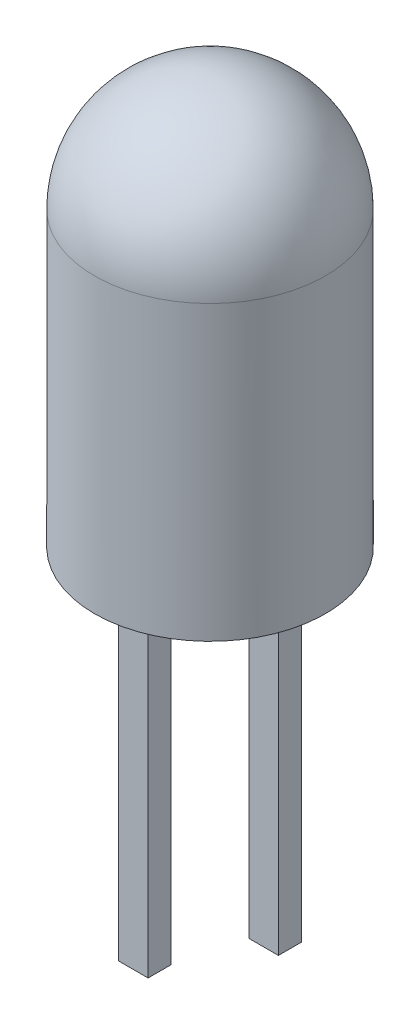
ISO-10303-21;
HEADER;
FILE_DESCRIPTION(('STEP AP214'),'2;1');
FILE_NAME('part.step','',(''),(''),'','','');
FILE_SCHEMA(('AUTOMOTIVE_DESIGN { 1 0 10303 214 1 1 1 1 }'));
ENDSEC;
DATA;
#1=APPLICATION_CONTEXT('core data for automotive mechanical design processes');
#2=APPLICATION_PROTOCOL_DEFINITION('international standard','automotive_design',2000,#1);
#3=PRODUCT_CONTEXT('',#1,'mechanical');
#4=PRODUCT('Part','Part','',(#3));
#5=PRODUCT_RELATED_PRODUCT_CATEGORY('part','',(#4));
#6=PRODUCT_DEFINITION_FORMATION('','',#4);
#7=PRODUCT_DEFINITION_CONTEXT('part definition',#1,'design');
#8=PRODUCT_DEFINITION('design','',#6,#7);
#9=PRODUCT_DEFINITION_SHAPE('','',#8);
#10=(LENGTH_UNIT() NAMED_UNIT(*) SI_UNIT(.MILLI.,.METRE.));
#11=(NAMED_UNIT(*) PLANE_ANGLE_UNIT() SI_UNIT($,.RADIAN.));
#12=(NAMED_UNIT(*) SI_UNIT($,.STERADIAN.) SOLID_ANGLE_UNIT());
#13=UNCERTAINTY_MEASURE_WITH_UNIT(LENGTH_MEASURE(1.E-05),#10,'distance_accuracy_value','');
#14=(GEOMETRIC_REPRESENTATION_CONTEXT(3) GLOBAL_UNCERTAINTY_ASSIGNED_CONTEXT((#13)) GLOBAL_UNIT_ASSIGNED_CONTEXT((#10,
#11,#12)) REPRESENTATION_CONTEXT('',''));
#15=CARTESIAN_POINT('',(0.,0.,0.));
#16=DIRECTION('',(0.,0.,1.));
#17=DIRECTION('',(1.,0.,0.));
#18=AXIS2_PLACEMENT_3D('',#15,#16,#17);
#19=CARTESIAN_POINT('',(-0.0605595659989582,2.80694027615572,0.));
#20=DIRECTION('',(0.,-1.,0.));
#21=DIRECTION('',(1.,0.,0.));
#22=AXIS2_PLACEMENT_3D('',#19,#20,#21);
#23=CYLINDRICAL_SURFACE('',#22,0.189425793844278);
#24=CARTESIAN_POINT('',(-0.0605595659989582,2.80694027615572,0.));
#25=DIRECTION('',(0.,1.,0.));
#26=DIRECTION('',(-1.,0.,0.));
#27=AXIS2_PLACEMENT_3D('',#24,#25,#26);
#28=CIRCLE('',#27,0.189425793844278);
#29=CARTESIAN_POINT('',(-0.249985359843236,2.80694027615572,0.));
#30=VERTEX_POINT('',#29);
#31=EDGE_CURVE('E11',#30,#30,#28,.T.);
#32=ORIENTED_EDGE('',*,*,#31,.F.);
#33=EDGE_LOOP('',(#32));
#34=FACE_BOUND('',#33,.T.);
#35=CARTESIAN_POINT('',(-0.0605595659989582,2.70694027615572,0.));
#36=DIRECTION('',(0.,1.,0.));
#37=DIRECTION('',(-1.,0.,0.));
#38=AXIS2_PLACEMENT_3D('',#35,#36,#37);
#39=CIRCLE('',#38,0.189425793844278);
#40=CARTESIAN_POINT('',(-0.249985359843236,2.70694027615572,0.));
#41=VERTEX_POINT('',#40);
#42=EDGE_CURVE('E51',#41,#41,#39,.T.);
#43=ORIENTED_EDGE('',*,*,#42,.T.);
#44=EDGE_LOOP('',(#43));
#45=FACE_BOUND('',#44,.T.);
#46=ADVANCED_FACE('F48',(#34,#45),#23,.T.);
#47=CARTESIAN_POINT('',(-0.0605595659989582,2.80694027615572,0.));
#48=DIRECTION('',(0.,1.,0.));
#49=DIRECTION('',(-1.,0.,0.));
#50=AXIS2_PLACEMENT_3D('',#47,#48,#49);
#51=PLANE('',#50);
#52=ORIENTED_EDGE('',*,*,#31,.T.);
#53=EDGE_LOOP('',(#52));
#54=FACE_BOUND('',#53,.T.);
#55=ADVANCED_FACE('F63',(#54),#51,.T.);
#56=CARTESIAN_POINT('',(-0.0605595659989582,2.70694027615572,0.));
#57=DIRECTION('',(0.,1.,0.));
#58=DIRECTION('',(-1.,0.,0.));
#59=AXIS2_PLACEMENT_3D('',#56,#57,#58);
#60=PLANE('',#59);
#61=ORIENTED_EDGE('',*,*,#42,.F.);
#62=EDGE_LOOP('',(#61));
#63=FACE_BOUND('',#62,.T.);
#64=ADVANCED_FACE('F61',(#63),#60,.F.);
#65=CLOSED_SHELL('',(#46,#55,#64));
#66=MANIFOLD_SOLID_BREP('B2',#65);
#67=CARTESIAN_POINT('',(0.654816514950922,-4.,0.149242281114547));
#68=DIRECTION('',(1.,0.,0.));
#69=DIRECTION('',(0.,0.,-1.));
#70=AXIS2_PLACEMENT_3D('',#67,#68,#69);
#71=PLANE('',#70);
#72=DIRECTION('',(0.,1.,0.));
#73=VECTOR('',#72,1.);
#74=CARTESIAN_POINT('',(0.654816514950922,-4.,0.149242281114547));
#75=LINE('',#74,#73);
#76=CARTESIAN_POINT('',(0.654816514950922,-4.,0.149242281114547));
#77=VERTEX_POINT('',#76);
#78=CARTESIAN_POINT('',(0.654816514950922,0.,0.149242281114547));
#79=VERTEX_POINT('',#78);
#80=EDGE_CURVE('E495',#77,#79,#75,.T.);
#81=ORIENTED_EDGE('',*,*,#80,.T.);
#82=DIRECTION('',(0.,0.,-1.));
#83=VECTOR('',#82,1.);
#84=CARTESIAN_POINT('',(0.654816514950922,0.,0.15));
#85=LINE('',#84,#83);
#86=CARTESIAN_POINT('',(0.654816514950922,0.,0.15));
#87=VERTEX_POINT('',#86);
#88=EDGE_CURVE('E251',#87,#79,#85,.T.);
#89=ORIENTED_EDGE('',*,*,#88,.F.);
#90=DIRECTION('',(0.,-1.,0.));
#91=VECTOR('',#90,1.);
#92=CARTESIAN_POINT('',(0.654816514950922,1.55125542870119,0.15));
#93=LINE('',#92,#91);
#94=CARTESIAN_POINT('',(0.654816514950922,1.55125542870119,0.15));
#95=VERTEX_POINT('',#94);
#96=EDGE_CURVE('E325',#95,#87,#93,.T.);
#97=ORIENTED_EDGE('',*,*,#96,.F.);
#98=DIRECTION('',(0.,0.,-1.));
#99=VECTOR('',#98,1.);
#100=CARTESIAN_POINT('',(0.654816514950922,1.55125542870119,0.15));
#101=LINE('',#100,#99);
#102=CARTESIAN_POINT('',(0.654816514950922,1.55125542870119,-0.15));
#103=VERTEX_POINT('',#102);
#104=EDGE_CURVE('E246',#95,#103,#101,.T.);
#105=ORIENTED_EDGE('',*,*,#104,.T.);
#106=DIRECTION('',(0.,-1.,0.));
#107=VECTOR('',#106,1.);
#108=CARTESIAN_POINT('',(0.654816514950922,1.55125542870119,-0.15));
#109=LINE('',#108,#107);
#110=CARTESIAN_POINT('',(0.654816514950922,0.,-0.15));
#111=VERTEX_POINT('',#110);
#112=EDGE_CURVE('E269',#103,#111,#109,.T.);
#113=ORIENTED_EDGE('',*,*,#112,.T.);
#114=CARTESIAN_POINT('',(0.654816514950922,0.,-0.149242281114547));
#115=VERTEX_POINT('',#114);
#116=EDGE_CURVE('E235',#115,#111,#85,.T.);
#117=ORIENTED_EDGE('',*,*,#116,.F.);
#118=DIRECTION('',(0.,1.,0.));
#119=VECTOR('',#118,1.);
#120=CARTESIAN_POINT('',(0.654816514950922,-4.,-0.149242281114547));
#121=LINE('',#120,#119);
#122=CARTESIAN_POINT('',(0.654816514950922,-4.,-0.149242281114547));
#123=VERTEX_POINT('',#122);
#124=EDGE_CURVE('E46',#123,#115,#121,.T.);
#125=ORIENTED_EDGE('',*,*,#124,.F.);
#126=DIRECTION('',(0.,0.,-1.));
#127=VECTOR('',#126,1.);
#128=CARTESIAN_POINT('',(0.654816514950922,-4.,0.149242281114547));
#129=LINE('',#128,#127);
#130=EDGE_CURVE('E486',#77,#123,#129,.T.);
#131=ORIENTED_EDGE('',*,*,#130,.F.);
#132=EDGE_LOOP('',(#81,#89,#97,#105,#113,#117,#125,#131));
#133=FACE_BOUND('',#132,.T.);
#134=ADVANCED_FACE('F99',(#133),#71,.F.);
#135=CARTESIAN_POINT('',(1.03787854119038,-4.,-0.149242281114547));
#136=DIRECTION('',(0.,0.,1.));
#137=DIRECTION('',(1.,0.,0.));
#138=AXIS2_PLACEMENT_3D('',#135,#136,#137);
#139=PLANE('',#138);
#140=DIRECTION('',(1.,0.,0.));
#141=VECTOR('',#140,1.);
#142=CARTESIAN_POINT('',(1.03787854119038,0.,-0.149242281114547));
#143=LINE('',#142,#141);
#144=CARTESIAN_POINT('',(1.03787854119038,0.,-0.149242281114547));
#145=VERTEX_POINT('',#144);
#146=EDGE_CURVE('E222',#115,#145,#143,.T.);
#147=ORIENTED_EDGE('',*,*,#146,.T.);
#148=DIRECTION('',(0.,1.,0.));
#149=VECTOR('',#148,1.);
#150=CARTESIAN_POINT('',(1.03787854119038,-4.,-0.149242281114547));
#151=LINE('',#150,#149);
#152=CARTESIAN_POINT('',(1.03787854119038,-4.,-0.149242281114547));
#153=VERTEX_POINT('',#152);
#154=EDGE_CURVE('E108',#153,#145,#151,.T.);
#155=ORIENTED_EDGE('',*,*,#154,.F.);
#156=DIRECTION('',(1.,0.,0.));
#157=VECTOR('',#156,1.);
#158=CARTESIAN_POINT('',(1.03787854119038,-4.,-0.149242281114547));
#159=LINE('',#158,#157);
#160=EDGE_CURVE('E487',#123,#153,#159,.T.);
#161=ORIENTED_EDGE('',*,*,#160,.F.);
#162=ORIENTED_EDGE('',*,*,#124,.T.);
#163=EDGE_LOOP('',(#147,#155,#161,#162));
#164=FACE_BOUND('',#163,.T.);
#165=ADVANCED_FACE('F352',(#164),#139,.F.);
#166=CARTESIAN_POINT('',(1.03787854119038,-4.,0.149242281114547));
#167=DIRECTION('',(-1.,0.,0.));
#168=DIRECTION('',(0.,0.,1.));
#169=AXIS2_PLACEMENT_3D('',#166,#167,#168);
#170=PLANE('',#169);
#171=ORIENTED_EDGE('',*,*,#154,.T.);
#172=DIRECTION('',(0.,0.,-1.));
#173=VECTOR('',#172,1.);
#174=CARTESIAN_POINT('',(1.03787854119038,0.,0.15));
#175=LINE('',#174,#173);
#176=CARTESIAN_POINT('',(1.03787854119038,0.,-0.15));
#177=VERTEX_POINT('',#176);
#178=EDGE_CURVE('E236',#145,#177,#175,.T.);
#179=ORIENTED_EDGE('',*,*,#178,.T.);
#180=DIRECTION('',(0.,1.,0.));
#181=VECTOR('',#180,1.);
#182=CARTESIAN_POINT('',(1.03787854119038,2.26044556615674,-0.15));
#183=LINE('',#182,#181);
#184=CARTESIAN_POINT('',(1.03787854119038,2.26044556615674,-0.15));
#185=VERTEX_POINT('',#184);
#186=EDGE_CURVE('E280',#177,#185,#183,.T.);
#187=ORIENTED_EDGE('',*,*,#186,.T.);
#188=DIRECTION('',(0.,0.,-1.));
#189=VECTOR('',#188,1.);
#190=CARTESIAN_POINT('',(1.03787854119038,2.26044556615674,0.15));
#191=LINE('',#190,#189);
#192=CARTESIAN_POINT('',(1.03787854119038,2.26044556615674,0.15));
#193=VERTEX_POINT('',#192);
#194=EDGE_CURVE('E241',#193,#185,#191,.T.);
#195=ORIENTED_EDGE('',*,*,#194,.F.);
#196=DIRECTION('',(0.,1.,0.));
#197=VECTOR('',#196,1.);
#198=CARTESIAN_POINT('',(1.03787854119038,1.55125542870119,0.15));
#199=LINE('',#198,#197);
#200=CARTESIAN_POINT('',(1.03787854119038,0.,0.15));
#201=VERTEX_POINT('',#200);
#202=EDGE_CURVE('E287',#201,#193,#199,.T.);
#203=ORIENTED_EDGE('',*,*,#202,.F.);
#204=CARTESIAN_POINT('',(1.03787854119038,0.,0.149242281114547));
#205=VERTEX_POINT('',#204);
#206=EDGE_CURVE('E231',#201,#205,#175,.T.);
#207=ORIENTED_EDGE('',*,*,#206,.T.);
#208=DIRECTION('',(0.,1.,0.));
#209=VECTOR('',#208,1.);
#210=CARTESIAN_POINT('',(1.03787854119038,-4.,0.149242281114547));
#211=LINE('',#210,#209);
#212=CARTESIAN_POINT('',(1.03787854119038,-4.,0.149242281114547));
#213=VERTEX_POINT('',#212);
#214=EDGE_CURVE('E501',#213,#205,#211,.T.);
#215=ORIENTED_EDGE('',*,*,#214,.F.);
#216=DIRECTION('',(0.,0.,1.));
#217=VECTOR('',#216,1.);
#218=CARTESIAN_POINT('',(1.03787854119038,-4.,0.149242281114547));
#219=LINE('',#218,#217);
#220=EDGE_CURVE('E490',#153,#213,#219,.T.);
#221=ORIENTED_EDGE('',*,*,#220,.F.);
#222=EDGE_LOOP('',(#171,#179,#187,#195,#203,#207,#215,#221));
#223=FACE_BOUND('',#222,.T.);
#224=ADVANCED_FACE('F338',(#223),#170,.F.);
#225=CARTESIAN_POINT('',(1.03787854119038,-4.,0.149242281114547));
#226=DIRECTION('',(0.,0.,-1.));
#227=DIRECTION('',(-1.,0.,0.));
#228=AXIS2_PLACEMENT_3D('',#225,#226,#227);
#229=PLANE('',#228);
#230=DIRECTION('',(-1.,0.,0.));
#231=VECTOR('',#230,1.);
#232=CARTESIAN_POINT('',(1.03787854119038,0.,0.149242281114547));
#233=LINE('',#232,#231);
#234=EDGE_CURVE('E225',#205,#79,#233,.T.);
#235=ORIENTED_EDGE('',*,*,#234,.T.);
#236=ORIENTED_EDGE('',*,*,#80,.F.);
#237=DIRECTION('',(-1.,0.,0.));
#238=VECTOR('',#237,1.);
#239=CARTESIAN_POINT('',(1.03787854119038,-4.,0.149242281114547));
#240=LINE('',#239,#238);
#241=EDGE_CURVE('E116',#213,#77,#240,.T.);
#242=ORIENTED_EDGE('',*,*,#241,.F.);
#243=ORIENTED_EDGE('',*,*,#214,.T.);
#244=EDGE_LOOP('',(#235,#236,#242,#243));
#245=FACE_BOUND('',#244,.T.);
#246=ADVANCED_FACE('F360',(#245),#229,.F.);
#247=CARTESIAN_POINT('',(0.,-4.,0.));
#248=DIRECTION('',(0.,1.,0.));
#249=DIRECTION('',(0.,0.,1.));
#250=AXIS2_PLACEMENT_3D('',#247,#248,#249);
#251=PLANE('',#250);
#252=ORIENTED_EDGE('',*,*,#130,.T.);
#253=ORIENTED_EDGE('',*,*,#160,.T.);
#254=ORIENTED_EDGE('',*,*,#220,.T.);
#255=ORIENTED_EDGE('',*,*,#241,.T.);
#256=EDGE_LOOP('',(#252,#253,#254,#255));
#257=FACE_BOUND('',#256,.T.);
#258=ADVANCED_FACE('F365',(#257),#251,.F.);
#259=CARTESIAN_POINT('',(1.03787854119038,0.,0.15));
#260=DIRECTION('',(0.,1.,0.));
#261=DIRECTION('',(0.,0.,1.));
#262=AXIS2_PLACEMENT_3D('',#259,#260,#261);
#263=PLANE('',#262);
#264=ORIENTED_EDGE('',*,*,#234,.F.);
#265=ORIENTED_EDGE('',*,*,#206,.F.);
#266=DIRECTION('',(1.,0.,0.));
#267=VECTOR('',#266,1.);
#268=CARTESIAN_POINT('',(1.03787854119038,0.,0.15));
#269=LINE('',#268,#267);
#270=EDGE_CURVE('E289',#87,#201,#269,.T.);
#271=ORIENTED_EDGE('',*,*,#270,.F.);
#272=ORIENTED_EDGE('',*,*,#88,.T.);
#273=EDGE_LOOP('',(#264,#265,#271,#272));
#274=FACE_BOUND('',#273,.T.);
#275=ADVANCED_FACE('F333',(#274),#263,.F.);
#276=CARTESIAN_POINT('',(0.23596965825384,2.70694027615572,0.15));
#277=DIRECTION('',(0.815238267293768,-0.57912569234999,0.));
#278=DIRECTION('',(0.57912569234999,0.815238267293768,0.));
#279=AXIS2_PLACEMENT_3D('',#276,#277,#278);
#280=PLANE('',#279);
#281=DIRECTION('',(-0.57912569234999,-0.815238267293768,0.));
#282=VECTOR('',#281,1.);
#283=CARTESIAN_POINT('',(0.23596965825384,2.70694027615572,-0.15));
#284=LINE('',#283,#282);
#285=CARTESIAN_POINT('',(0.29411762082703,2.78879546731892,-0.15));
#286=VERTEX_POINT('',#285);
#287=CARTESIAN_POINT('',(0.23596965825384,2.70694027615572,-0.15));
#288=VERTEX_POINT('',#287);
#289=EDGE_CURVE('E221',#286,#288,#284,.T.);
#290=ORIENTED_EDGE('',*,*,#289,.T.);
#291=DIRECTION('',(0.,0.,-1.));
#292=VECTOR('',#291,1.);
#293=CARTESIAN_POINT('',(0.23596965825384,2.70694027615572,0.15));
#294=LINE('',#293,#292);
#295=CARTESIAN_POINT('',(0.23596965825384,2.70694027615572,0.15));
#296=VERTEX_POINT('',#295);
#297=EDGE_CURVE('E201',#296,#288,#294,.T.);
#298=ORIENTED_EDGE('',*,*,#297,.F.);
#299=DIRECTION('',(-0.57912569234999,-0.815238267293768,0.));
#300=VECTOR('',#299,1.);
#301=CARTESIAN_POINT('',(0.23596965825384,2.70694027615572,0.15));
#302=LINE('',#301,#300);
#303=CARTESIAN_POINT('',(0.29411762082703,2.78879546731892,0.15));
#304=VERTEX_POINT('',#303);
#305=EDGE_CURVE('E208',#304,#296,#302,.T.);
#306=ORIENTED_EDGE('',*,*,#305,.F.);
#307=DIRECTION('',(0.,0.,-1.));
#308=VECTOR('',#307,1.);
#309=CARTESIAN_POINT('',(0.29411762082703,2.78879546731892,0.15));
#310=LINE('',#309,#308);
#311=EDGE_CURVE('E285',#304,#286,#310,.T.);
#312=ORIENTED_EDGE('',*,*,#311,.T.);
#313=EDGE_LOOP('',(#290,#298,#306,#312));
#314=FACE_BOUND('',#313,.T.);
#315=ADVANCED_FACE('F219',(#314),#280,.F.);
#316=CARTESIAN_POINT('',(-0.385685641410784,2.70694027615572,0.15));
#317=DIRECTION('',(0.,-1.,0.));
#318=DIRECTION('',(1.,0.,0.));
#319=AXIS2_PLACEMENT_3D('',#316,#317,#318);
#320=PLANE('',#319);
#321=DIRECTION('',(-1.,0.,0.));
#322=VECTOR('',#321,1.);
#323=CARTESIAN_POINT('',(-0.385685641410784,2.70694027615572,-0.15));
#324=LINE('',#323,#322);
#325=CARTESIAN_POINT('',(-0.385685641410784,2.70694027615572,-0.15));
#326=VERTEX_POINT('',#325);
#327=EDGE_CURVE('E294',#288,#326,#324,.T.);
#328=ORIENTED_EDGE('',*,*,#327,.T.);
#329=DIRECTION('',(0.,0.,-1.));
#330=VECTOR('',#329,1.);
#331=CARTESIAN_POINT('',(-0.385685641410784,2.70694027615572,0.15));
#332=LINE('',#331,#330);
#333=CARTESIAN_POINT('',(-0.385685641410784,2.70694027615572,0.15));
#334=VERTEX_POINT('',#333);
#335=EDGE_CURVE('E204',#334,#326,#332,.T.);
#336=ORIENTED_EDGE('',*,*,#335,.F.);
#337=DIRECTION('',(-1.,0.,0.));
#338=VECTOR('',#337,1.);
#339=CARTESIAN_POINT('',(-0.385685641410784,2.70694027615572,0.15));
#340=LINE('',#339,#338);
#341=EDGE_CURVE('E197',#296,#334,#340,.T.);
#342=ORIENTED_EDGE('',*,*,#341,.F.);
#343=ORIENTED_EDGE('',*,*,#297,.T.);
#344=EDGE_LOOP('',(#328,#336,#342,#343));
#345=FACE_BOUND('',#344,.T.);
#346=ADVANCED_FACE('F199',(#345),#320,.F.);
#347=CARTESIAN_POINT('',(-0.512741887489072,2.79672069741169,0.15));
#348=DIRECTION('',(-0.57708493627475,-0.816684134978002,0.));
#349=DIRECTION('',(0.816684134978002,-0.57708493627475,0.));
#350=AXIS2_PLACEMENT_3D('',#347,#348,#349);
#351=PLANE('',#350);
#352=DIRECTION('',(-0.816684134978002,0.57708493627475,0.));
#353=VECTOR('',#352,1.);
#354=CARTESIAN_POINT('',(-0.512741887489072,2.79672069741169,-0.15));
#355=LINE('',#354,#353);
#356=CARTESIAN_POINT('',(-0.512741887489072,2.79672069741169,-0.15));
#357=VERTEX_POINT('',#356);
#358=EDGE_CURVE('E296',#326,#357,#355,.T.);
#359=ORIENTED_EDGE('',*,*,#358,.T.);
#360=DIRECTION('',(0.,0.,-1.));
#361=VECTOR('',#360,1.);
#362=CARTESIAN_POINT('',(-0.512741887489072,2.79672069741169,0.15));
#363=LINE('',#362,#361);
#364=CARTESIAN_POINT('',(-0.512741887489072,2.79672069741169,0.15));
#365=VERTEX_POINT('',#364);
#366=EDGE_CURVE('E227',#365,#357,#363,.T.);
#367=ORIENTED_EDGE('',*,*,#366,.F.);
#368=DIRECTION('',(-0.816684134978002,0.57708493627475,0.));
#369=VECTOR('',#368,1.);
#370=CARTESIAN_POINT('',(-0.512741887489072,2.79672069741169,0.15));
#371=LINE('',#370,#369);
#372=EDGE_CURVE('E207',#334,#365,#371,.T.);
#373=ORIENTED_EDGE('',*,*,#372,.F.);
#374=ORIENTED_EDGE('',*,*,#335,.T.);
#375=EDGE_LOOP('',(#359,#367,#373,#374));
#376=FACE_BOUND('',#375,.T.);
#377=ADVANCED_FACE('F342',(#376),#351,.F.);
#378=CARTESIAN_POINT('',(-0.565939224682698,2.79672069741169,0.15));
#379=DIRECTION('',(0.,-1.,0.));
#380=DIRECTION('',(0.,0.,-1.));
#381=AXIS2_PLACEMENT_3D('',#378,#379,#380);
#382=PLANE('',#381);
#383=DIRECTION('',(-1.,0.,0.));
#384=VECTOR('',#383,1.);
#385=CARTESIAN_POINT('',(-0.565939224682698,2.79672069741169,-0.15));
#386=LINE('',#385,#384);
#387=CARTESIAN_POINT('',(-0.565939224682698,2.79672069741169,-0.15));
#388=VERTEX_POINT('',#387);
#389=EDGE_CURVE('E298',#357,#388,#386,.T.);
#390=ORIENTED_EDGE('',*,*,#389,.T.);
#391=DIRECTION('',(0.,0.,-1.));
#392=VECTOR('',#391,1.);
#393=CARTESIAN_POINT('',(-0.565939224682698,2.79672069741169,0.15));
#394=LINE('',#393,#392);
#395=CARTESIAN_POINT('',(-0.565939224682698,2.79672069741169,0.15));
#396=VERTEX_POINT('',#395);
#397=EDGE_CURVE('E316',#396,#388,#394,.T.);
#398=ORIENTED_EDGE('',*,*,#397,.F.);
#399=DIRECTION('',(-1.,0.,0.));
#400=VECTOR('',#399,1.);
#401=CARTESIAN_POINT('',(-0.565939224682698,2.79672069741169,0.15));
#402=LINE('',#401,#400);
#403=EDGE_CURVE('E323',#365,#396,#402,.T.);
#404=ORIENTED_EDGE('',*,*,#403,.F.);
#405=ORIENTED_EDGE('',*,*,#366,.T.);
#406=EDGE_LOOP('',(#390,#398,#404,#405));
#407=FACE_BOUND('',#406,.T.);
#408=ADVANCED_FACE('F314',(#407),#382,.F.);
#409=CARTESIAN_POINT('',(-0.565939224682698,2.61715985489974,0.15));
#410=DIRECTION('',(1.,0.,0.));
#411=DIRECTION('',(0.,0.,-1.));
#412=AXIS2_PLACEMENT_3D('',#409,#410,#411);
#413=PLANE('',#412);
#414=DIRECTION('',(0.,-1.,0.));
#415=VECTOR('',#414,1.);
#416=CARTESIAN_POINT('',(-0.565939224682698,2.61715985489974,-0.15));
#417=LINE('',#416,#415);
#418=CARTESIAN_POINT('',(-0.565939224682698,2.41845099749163,-0.15));
#419=VERTEX_POINT('',#418);
#420=EDGE_CURVE('E301',#388,#419,#417,.T.);
#421=ORIENTED_EDGE('',*,*,#420,.T.);
#422=DIRECTION('',(0.,0.,-1.));
#423=VECTOR('',#422,1.);
#424=CARTESIAN_POINT('',(-0.565939224682698,2.41845099749163,0.15));
#425=LINE('',#424,#423);
#426=CARTESIAN_POINT('',(-0.565939224682698,2.41845099749163,0.15));
#427=VERTEX_POINT('',#426);
#428=EDGE_CURVE('E257',#427,#419,#425,.T.);
#429=ORIENTED_EDGE('',*,*,#428,.F.);
#430=DIRECTION('',(0.,-1.,0.));
#431=VECTOR('',#430,1.);
#432=CARTESIAN_POINT('',(-0.565939224682698,2.61715985489974,0.15));
#433=LINE('',#432,#431);
#434=EDGE_CURVE('E320',#396,#427,#433,.T.);
#435=ORIENTED_EDGE('',*,*,#434,.F.);
#436=ORIENTED_EDGE('',*,*,#397,.T.);
#437=EDGE_LOOP('',(#421,#429,#435,#436));
#438=FACE_BOUND('',#437,.T.);
#439=ADVANCED_FACE('F319',(#438),#413,.F.);
#440=CARTESIAN_POINT('',(0.654816514950922,1.55125542870119,0.15));
#441=DIRECTION('',(0.579125692349992,0.815238267293766,0.));
#442=DIRECTION('',(-0.815238267293766,0.579125692349992,0.));
#443=AXIS2_PLACEMENT_3D('',#440,#441,#442);
#444=PLANE('',#443);
#445=DIRECTION('',(0.815238267293766,-0.579125692349992,0.));
#446=VECTOR('',#445,1.);
#447=CARTESIAN_POINT('',(0.654816514950922,1.55125542870119,-0.15));
#448=LINE('',#447,#446);
#449=EDGE_CURVE('E275',#419,#103,#448,.T.);
#450=ORIENTED_EDGE('',*,*,#449,.T.);
#451=ORIENTED_EDGE('',*,*,#104,.F.);
#452=DIRECTION('',(0.815238267293766,-0.579125692349992,0.));
#453=VECTOR('',#452,1.);
#454=CARTESIAN_POINT('',(0.654816514950922,1.55125542870119,0.15));
#455=LINE('',#454,#453);
#456=EDGE_CURVE('E322',#427,#95,#455,.T.);
#457=ORIENTED_EDGE('',*,*,#456,.F.);
#458=ORIENTED_EDGE('',*,*,#428,.T.);
#459=EDGE_LOOP('',(#450,#451,#457,#458));
#460=FACE_BOUND('',#459,.T.);
#461=ADVANCED_FACE('F304',(#460),#444,.F.);
#462=ORIENTED_EDGE('',*,*,#146,.F.);
#463=ORIENTED_EDGE('',*,*,#116,.T.);
#464=DIRECTION('',(1.,0.,0.));
#465=VECTOR('',#464,1.);
#466=CARTESIAN_POINT('',(1.03787854119038,0.,-0.15));
#467=LINE('',#466,#465);
#468=EDGE_CURVE('E265',#111,#177,#467,.T.);
#469=ORIENTED_EDGE('',*,*,#468,.T.);
#470=ORIENTED_EDGE('',*,*,#178,.F.);
#471=EDGE_LOOP('',(#462,#463,#469,#470));
#472=FACE_BOUND('',#471,.T.);
#473=ADVANCED_FACE('F262',(#472),#263,.F.);
#474=CARTESIAN_POINT('',(1.03787854119038,2.26044556615674,0.15));
#475=DIRECTION('',(-0.579125692349993,-0.815238267293766,0.));
#476=DIRECTION('',(0.815238267293766,-0.579125692349993,0.));
#477=AXIS2_PLACEMENT_3D('',#474,#475,#476);
#478=PLANE('',#477);
#479=DIRECTION('',(-0.815238267293766,0.579125692349993,0.));
#480=VECTOR('',#479,1.);
#481=CARTESIAN_POINT('',(1.03787854119038,2.26044556615674,-0.15));
#482=LINE('',#481,#480);
#483=EDGE_CURVE('E217',#185,#286,#482,.T.);
#484=ORIENTED_EDGE('',*,*,#483,.T.);
#485=ORIENTED_EDGE('',*,*,#311,.F.);
#486=DIRECTION('',(-0.815238267293766,0.579125692349993,0.));
#487=VECTOR('',#486,1.);
#488=CARTESIAN_POINT('',(1.03787854119038,2.26044556615674,0.15));
#489=LINE('',#488,#487);
#490=EDGE_CURVE('E213',#193,#304,#489,.T.);
#491=ORIENTED_EDGE('',*,*,#490,.F.);
#492=ORIENTED_EDGE('',*,*,#194,.T.);
#493=EDGE_LOOP('',(#484,#485,#491,#492));
#494=FACE_BOUND('',#493,.T.);
#495=ADVANCED_FACE('F340',(#494),#478,.F.);
#496=CARTESIAN_POINT('',(0.,0.,0.15));
#497=DIRECTION('',(0.,0.,1.));
#498=DIRECTION('',(1.,0.,0.));
#499=AXIS2_PLACEMENT_3D('',#496,#497,#498);
#500=PLANE('',#499);
#501=ORIENTED_EDGE('',*,*,#305,.T.);
#502=ORIENTED_EDGE('',*,*,#341,.T.);
#503=ORIENTED_EDGE('',*,*,#372,.T.);
#504=ORIENTED_EDGE('',*,*,#403,.T.);
#505=ORIENTED_EDGE('',*,*,#434,.T.);
#506=ORIENTED_EDGE('',*,*,#456,.T.);
#507=ORIENTED_EDGE('',*,*,#96,.T.);
#508=ORIENTED_EDGE('',*,*,#270,.T.);
#509=ORIENTED_EDGE('',*,*,#202,.T.);
#510=ORIENTED_EDGE('',*,*,#490,.T.);
#511=EDGE_LOOP('',(#501,#502,#503,#504,#505,#506,#507,#508,#509,#510));
#512=FACE_BOUND('',#511,.T.);
#513=ADVANCED_FACE('F211',(#512),#500,.T.);
#514=CARTESIAN_POINT('',(0.,0.,-0.15));
#515=DIRECTION('',(0.,0.,1.));
#516=DIRECTION('',(1.,0.,0.));
#517=AXIS2_PLACEMENT_3D('',#514,#515,#516);
#518=PLANE('',#517);
#519=ORIENTED_EDGE('',*,*,#289,.F.);
#520=ORIENTED_EDGE('',*,*,#483,.F.);
#521=ORIENTED_EDGE('',*,*,#186,.F.);
#522=ORIENTED_EDGE('',*,*,#468,.F.);
#523=ORIENTED_EDGE('',*,*,#112,.F.);
#524=ORIENTED_EDGE('',*,*,#449,.F.);
#525=ORIENTED_EDGE('',*,*,#420,.F.);
#526=ORIENTED_EDGE('',*,*,#389,.F.);
#527=ORIENTED_EDGE('',*,*,#358,.F.);
#528=ORIENTED_EDGE('',*,*,#327,.F.);
#529=EDGE_LOOP('',(#519,#520,#521,#522,#523,#524,#525,#526,#527,#528));
#530=FACE_BOUND('',#529,.T.);
#531=ADVANCED_FACE('F278',(#530),#518,.F.);
#532=CLOSED_SHELL('',(#134,#165,#224,#246,#258,#275,#315,#346,#377,#408,#439,#461,#473,#495,
#513,#531));
#533=MANIFOLD_SOLID_BREP('B6',#532);
#534=CARTESIAN_POINT('',(-0.654816514950922,-4.,0.149242281114546));
#535=DIRECTION('',(-1.,0.,0.));
#536=DIRECTION('',(0.,0.,1.));
#537=AXIS2_PLACEMENT_3D('',#534,#535,#536);
#538=PLANE('',#537);
#539=DIRECTION('',(0.,1.,0.));
#540=VECTOR('',#539,1.);
#541=CARTESIAN_POINT('',(-0.654816514950922,-4.,-0.149242281114547));
#542=LINE('',#541,#540);
#543=CARTESIAN_POINT('',(-0.654816514950922,-5.1,-0.149242281114547));
#544=VERTEX_POINT('',#543);
#545=CARTESIAN_POINT('',(-0.654816514950922,0.,-0.149242281114547));
#546=VERTEX_POINT('',#545);
#547=EDGE_CURVE('E603',#544,#546,#542,.T.);
#548=ORIENTED_EDGE('',*,*,#547,.T.);
#549=DIRECTION('',(0.,0.,-1.));
#550=VECTOR('',#549,1.);
#551=CARTESIAN_POINT('',(-0.654816514950922,0.,0.15));
#552=LINE('',#551,#550);
#553=CARTESIAN_POINT('',(-0.654816514950922,0.,-0.15));
#554=VERTEX_POINT('',#553);
#555=EDGE_CURVE('E675',#546,#554,#552,.T.);
#556=ORIENTED_EDGE('',*,*,#555,.T.);
#557=DIRECTION('',(0.,1.,0.));
#558=VECTOR('',#557,1.);
#559=CARTESIAN_POINT('',(-0.654816514950922,0.,-0.15));
#560=LINE('',#559,#558);
#561=CARTESIAN_POINT('',(-0.654816514950922,1.55125542870119,-0.15));
#562=VERTEX_POINT('',#561);
#563=EDGE_CURVE('E649',#554,#562,#560,.T.);
#564=ORIENTED_EDGE('',*,*,#563,.T.);
#565=DIRECTION('',(0.,0.,-1.));
#566=VECTOR('',#565,1.);
#567=CARTESIAN_POINT('',(-0.654816514950922,1.55125542870119,0.15));
#568=LINE('',#567,#566);
#569=CARTESIAN_POINT('',(-0.654816514950922,1.55125542870119,0.15));
#570=VERTEX_POINT('',#569);
#571=EDGE_CURVE('E672',#570,#562,#568,.T.);
#572=ORIENTED_EDGE('',*,*,#571,.F.);
#573=DIRECTION('',(0.,1.,0.));
#574=VECTOR('',#573,1.);
#575=CARTESIAN_POINT('',(-0.654816514950922,0.,0.15));
#576=LINE('',#575,#574);
#577=CARTESIAN_POINT('',(-0.654816514950922,0.,0.15));
#578=VERTEX_POINT('',#577);
#579=EDGE_CURVE('E635',#578,#570,#576,.T.);
#580=ORIENTED_EDGE('',*,*,#579,.F.);
#581=CARTESIAN_POINT('',(-0.654816514950922,0.,0.149242281114546));
#582=VERTEX_POINT('',#581);
#583=EDGE_CURVE('E683',#578,#582,#552,.T.);
#584=ORIENTED_EDGE('',*,*,#583,.T.);
#585=DIRECTION('',(0.,1.,0.));
#586=VECTOR('',#585,1.);
#587=CARTESIAN_POINT('',(-0.654816514950922,-4.,0.149242281114546));
#588=LINE('',#587,#586);
#589=CARTESIAN_POINT('',(-0.654816514950922,-5.1,0.149242281114546));
#590=VERTEX_POINT('',#589);
#591=EDGE_CURVE('E97',#590,#582,#588,.T.);
#592=ORIENTED_EDGE('',*,*,#591,.F.);
#593=DIRECTION('',(0.,0.,1.));
#594=VECTOR('',#593,1.);
#595=CARTESIAN_POINT('',(-0.654816514950922,-5.1,-0.149242281114547));
#596=LINE('',#595,#594);
#597=EDGE_CURVE('E613',#544,#590,#596,.T.);
#598=ORIENTED_EDGE('',*,*,#597,.F.);
#599=EDGE_LOOP('',(#548,#556,#564,#572,#580,#584,#592,#598));
#600=FACE_BOUND('',#599,.T.);
#601=ADVANCED_FACE('F519',(#600),#538,.F.);
#602=CARTESIAN_POINT('',(-1.03787854119038,-4.,0.149242281114546));
#603=DIRECTION('',(0.,0.,-1.));
#604=DIRECTION('',(-1.,0.,0.));
#605=AXIS2_PLACEMENT_3D('',#602,#603,#604);
#606=PLANE('',#605);
#607=DIRECTION('',(-1.,0.,0.));
#608=VECTOR('',#607,1.);
#609=CARTESIAN_POINT('',(-1.03787854119038,0.,0.149242281114546));
#610=LINE('',#609,#608);
#611=CARTESIAN_POINT('',(-1.03787854119038,0.,0.149242281114546));
#612=VERTEX_POINT('',#611);
#613=EDGE_CURVE('E711',#582,#612,#610,.T.);
#614=ORIENTED_EDGE('',*,*,#613,.T.);
#615=DIRECTION('',(0.,1.,0.));
#616=VECTOR('',#615,1.);
#617=CARTESIAN_POINT('',(-1.03787854119038,-4.,0.149242281114546));
#618=LINE('',#617,#616);
#619=CARTESIAN_POINT('',(-1.03787854119038,-5.1,0.149242281114546));
#620=VERTEX_POINT('',#619);
#621=EDGE_CURVE('E527',#620,#612,#618,.T.);
#622=ORIENTED_EDGE('',*,*,#621,.F.);
#623=DIRECTION('',(-1.,0.,0.));
#624=VECTOR('',#623,1.);
#625=CARTESIAN_POINT('',(-0.654816514950922,-5.1,0.149242281114546));
#626=LINE('',#625,#624);
#627=EDGE_CURVE('E618',#590,#620,#626,.T.);
#628=ORIENTED_EDGE('',*,*,#627,.F.);
#629=ORIENTED_EDGE('',*,*,#591,.T.);
#630=EDGE_LOOP('',(#614,#622,#628,#629));
#631=FACE_BOUND('',#630,.T.);
#632=ADVANCED_FACE('F745',(#631),#606,.F.);
#633=CARTESIAN_POINT('',(-1.03787854119038,-4.,0.149242281114546));
#634=DIRECTION('',(1.,0.,0.));
#635=DIRECTION('',(0.,0.,-1.));
#636=AXIS2_PLACEMENT_3D('',#633,#634,#635);
#637=PLANE('',#636);
#638=ORIENTED_EDGE('',*,*,#621,.T.);
#639=DIRECTION('',(0.,0.,-1.));
#640=VECTOR('',#639,1.);
#641=CARTESIAN_POINT('',(-1.03787854119038,0.,0.15));
#642=LINE('',#641,#640);
#643=CARTESIAN_POINT('',(-1.03787854119038,0.,0.15));
#644=VERTEX_POINT('',#643);
#645=EDGE_CURVE('E535',#644,#612,#642,.T.);
#646=ORIENTED_EDGE('',*,*,#645,.F.);
#647=DIRECTION('',(0.,-1.,0.));
#648=VECTOR('',#647,1.);
#649=CARTESIAN_POINT('',(-1.03787854119038,1.55125542870119,0.15));
#650=LINE('',#649,#648);
#651=CARTESIAN_POINT('',(-1.03787854119038,2.61715985489974,0.15));
#652=VERTEX_POINT('',#651);
#653=EDGE_CURVE('E629',#652,#644,#650,.T.);
#654=ORIENTED_EDGE('',*,*,#653,.F.);
#655=DIRECTION('',(0.,0.,-1.));
#656=VECTOR('',#655,1.);
#657=CARTESIAN_POINT('',(-1.03787854119038,2.61715985489974,0.15));
#658=LINE('',#657,#656);
#659=CARTESIAN_POINT('',(-1.03787854119038,2.61715985489974,-0.15));
#660=VERTEX_POINT('',#659);
#661=EDGE_CURVE('E646',#652,#660,#658,.T.);
#662=ORIENTED_EDGE('',*,*,#661,.T.);
#663=DIRECTION('',(0.,-1.,0.));
#664=VECTOR('',#663,1.);
#665=CARTESIAN_POINT('',(-1.03787854119038,2.61715985489974,-0.15));
#666=LINE('',#665,#664);
#667=CARTESIAN_POINT('',(-1.03787854119038,0.,-0.15));
#668=VERTEX_POINT('',#667);
#669=EDGE_CURVE('E633',#660,#668,#666,.T.);
#670=ORIENTED_EDGE('',*,*,#669,.T.);
#671=CARTESIAN_POINT('',(-1.03787854119038,0.,-0.149242281114547));
#672=VERTEX_POINT('',#671);
#673=EDGE_CURVE('E684',#672,#668,#642,.T.);
#674=ORIENTED_EDGE('',*,*,#673,.F.);
#675=DIRECTION('',(0.,1.,0.));
#676=VECTOR('',#675,1.);
#677=CARTESIAN_POINT('',(-1.03787854119038,-4.,-0.149242281114547));
#678=LINE('',#677,#676);
#679=CARTESIAN_POINT('',(-1.03787854119038,-5.1,-0.149242281114547));
#680=VERTEX_POINT('',#679);
#681=EDGE_CURVE('E610',#680,#672,#678,.T.);
#682=ORIENTED_EDGE('',*,*,#681,.F.);
#683=DIRECTION('',(0.,0.,-1.));
#684=VECTOR('',#683,1.);
#685=CARTESIAN_POINT('',(-1.03787854119038,-5.1,0.149242281114546));
#686=LINE('',#685,#684);
#687=EDGE_CURVE('E623',#620,#680,#686,.T.);
#688=ORIENTED_EDGE('',*,*,#687,.F.);
#689=EDGE_LOOP('',(#638,#646,#654,#662,#670,#674,#682,#688));
#690=FACE_BOUND('',#689,.T.);
#691=ADVANCED_FACE('F728',(#690),#637,.F.);
#692=CARTESIAN_POINT('',(-1.03787854119038,-4.,-0.149242281114547));
#693=DIRECTION('',(0.,0.,1.));
#694=DIRECTION('',(1.,0.,0.));
#695=AXIS2_PLACEMENT_3D('',#692,#693,#694);
#696=PLANE('',#695);
#697=DIRECTION('',(1.,0.,0.));
#698=VECTOR('',#697,1.);
#699=CARTESIAN_POINT('',(-1.03787854119038,0.,-0.149242281114547));
#700=LINE('',#699,#698);
#701=EDGE_CURVE('E543',#672,#546,#700,.T.);
#702=ORIENTED_EDGE('',*,*,#701,.T.);
#703=ORIENTED_EDGE('',*,*,#547,.F.);
#704=DIRECTION('',(1.,0.,0.));
#705=VECTOR('',#704,1.);
#706=CARTESIAN_POINT('',(-1.03787854119038,-5.1,-0.149242281114547));
#707=LINE('',#706,#705);
#708=EDGE_CURVE('E608',#680,#544,#707,.T.);
#709=ORIENTED_EDGE('',*,*,#708,.F.);
#710=ORIENTED_EDGE('',*,*,#681,.T.);
#711=EDGE_LOOP('',(#702,#703,#709,#710));
#712=FACE_BOUND('',#711,.T.);
#713=ADVANCED_FACE('F605',(#712),#696,.F.);
#714=CARTESIAN_POINT('',(-1.03787854119038,0.,0.15));
#715=DIRECTION('',(0.,1.,0.));
#716=DIRECTION('',(0.,0.,1.));
#717=AXIS2_PLACEMENT_3D('',#714,#715,#716);
#718=PLANE('',#717);
#719=ORIENTED_EDGE('',*,*,#701,.F.);
#720=ORIENTED_EDGE('',*,*,#673,.T.);
#721=DIRECTION('',(1.,0.,0.));
#722=VECTOR('',#721,1.);
#723=CARTESIAN_POINT('',(-1.03787854119038,0.,-0.15));
#724=LINE('',#723,#722);
#725=EDGE_CURVE('E628',#668,#554,#724,.T.);
#726=ORIENTED_EDGE('',*,*,#725,.T.);
#727=ORIENTED_EDGE('',*,*,#555,.F.);
#728=EDGE_LOOP('',(#719,#720,#726,#727));
#729=FACE_BOUND('',#728,.T.);
#730=ADVANCED_FACE('F691',(#729),#718,.F.);
#731=ORIENTED_EDGE('',*,*,#613,.F.);
#732=ORIENTED_EDGE('',*,*,#583,.F.);
#733=DIRECTION('',(1.,0.,0.));
#734=VECTOR('',#733,1.);
#735=CARTESIAN_POINT('',(-1.03787854119038,0.,0.15));
#736=LINE('',#735,#734);
#737=EDGE_CURVE('E632',#644,#578,#736,.T.);
#738=ORIENTED_EDGE('',*,*,#737,.F.);
#739=ORIENTED_EDGE('',*,*,#645,.T.);
#740=EDGE_LOOP('',(#731,#732,#738,#739));
#741=FACE_BOUND('',#740,.T.);
#742=ADVANCED_FACE('F710',(#741),#718,.F.);
#743=CARTESIAN_POINT('',(0.482142428269985,1.55125542870119,0.15));
#744=DIRECTION('',(0.,1.,0.));
#745=DIRECTION('',(0.,0.,1.));
#746=AXIS2_PLACEMENT_3D('',#743,#744,#745);
#747=PLANE('',#746);
#748=DIRECTION('',(1.,0.,0.));
#749=VECTOR('',#748,1.);
#750=CARTESIAN_POINT('',(0.482142428269985,1.55125542870119,-0.15));
#751=LINE('',#750,#749);
#752=CARTESIAN_POINT('',(0.482142428269985,1.55125542870119,-0.15));
#753=VERTEX_POINT('',#752);
#754=EDGE_CURVE('E651',#562,#753,#751,.T.);
#755=ORIENTED_EDGE('',*,*,#754,.T.);
#756=DIRECTION('',(0.,0.,-1.));
#757=VECTOR('',#756,1.);
#758=CARTESIAN_POINT('',(0.482142428269985,1.55125542870119,0.15));
#759=LINE('',#758,#757);
#760=CARTESIAN_POINT('',(0.482142428269985,1.55125542870119,0.15));
#761=VERTEX_POINT('',#760);
#762=EDGE_CURVE('E669',#761,#753,#759,.T.);
#763=ORIENTED_EDGE('',*,*,#762,.F.);
#764=DIRECTION('',(1.,0.,0.));
#765=VECTOR('',#764,1.);
#766=CARTESIAN_POINT('',(0.482142428269985,1.55125542870119,0.15));
#767=LINE('',#766,#765);
#768=EDGE_CURVE('E637',#570,#761,#767,.T.);
#769=ORIENTED_EDGE('',*,*,#768,.F.);
#770=ORIENTED_EDGE('',*,*,#571,.T.);
#771=EDGE_LOOP('',(#755,#763,#769,#770));
#772=FACE_BOUND('',#771,.T.);
#773=ADVANCED_FACE('F700',(#772),#747,.F.);
#774=CARTESIAN_POINT('',(0.482142428269985,1.55125542870119,0.15));
#775=DIRECTION('',(-0.579125692349992,-0.815238267293766,0.));
#776=DIRECTION('',(0.815238267293766,-0.579125692349993,0.));
#777=AXIS2_PLACEMENT_3D('',#774,#775,#776);
#778=PLANE('',#777);
#779=DIRECTION('',(-0.815238267293766,0.579125692349992,0.));
#780=VECTOR('',#779,1.);
#781=CARTESIAN_POINT('',(0.482142428269985,1.55125542870119,-0.15));
#782=LINE('',#781,#780);
#783=CARTESIAN_POINT('',(-0.665939224682699,2.36682507111711,-0.15));
#784=VERTEX_POINT('',#783);
#785=EDGE_CURVE('E653',#753,#784,#782,.T.);
#786=ORIENTED_EDGE('',*,*,#785,.T.);
#787=DIRECTION('',(0.,0.,-1.));
#788=VECTOR('',#787,1.);
#789=CARTESIAN_POINT('',(-0.665939224682699,2.36682507111711,0.15));
#790=LINE('',#789,#788);
#791=CARTESIAN_POINT('',(-0.665939224682699,2.36682507111711,0.15));
#792=VERTEX_POINT('',#791);
#793=EDGE_CURVE('E666',#792,#784,#790,.T.);
#794=ORIENTED_EDGE('',*,*,#793,.F.);
#795=DIRECTION('',(-0.815238267293766,0.579125692349992,0.));
#796=VECTOR('',#795,1.);
#797=CARTESIAN_POINT('',(0.482142428269985,1.55125542870119,0.15));
#798=LINE('',#797,#796);
#799=EDGE_CURVE('E639',#761,#792,#798,.T.);
#800=ORIENTED_EDGE('',*,*,#799,.F.);
#801=ORIENTED_EDGE('',*,*,#762,.T.);
#802=EDGE_LOOP('',(#786,#794,#800,#801));
#803=FACE_BOUND('',#802,.T.);
#804=ADVANCED_FACE('F704',(#803),#778,.F.);
#805=CARTESIAN_POINT('',(-0.665939224682699,2.61715985489974,0.15));
#806=DIRECTION('',(-1.,0.,0.));
#807=DIRECTION('',(0.,0.,1.));
#808=AXIS2_PLACEMENT_3D('',#805,#806,#807);
#809=PLANE('',#808);
#810=DIRECTION('',(0.,1.,0.));
#811=VECTOR('',#810,1.);
#812=CARTESIAN_POINT('',(-0.665939224682699,2.61715985489974,-0.15));
#813=LINE('',#812,#811);
#814=CARTESIAN_POINT('',(-0.665939224682699,2.61715985489974,-0.15));
#815=VERTEX_POINT('',#814);
#816=EDGE_CURVE('E655',#784,#815,#813,.T.);
#817=ORIENTED_EDGE('',*,*,#816,.T.);
#818=DIRECTION('',(0.,0.,-1.));
#819=VECTOR('',#818,1.);
#820=CARTESIAN_POINT('',(-0.665939224682699,2.61715985489974,0.15));
#821=LINE('',#820,#819);
#822=CARTESIAN_POINT('',(-0.665939224682699,2.61715985489974,0.15));
#823=VERTEX_POINT('',#822);
#824=EDGE_CURVE('E663',#823,#815,#821,.T.);
#825=ORIENTED_EDGE('',*,*,#824,.F.);
#826=DIRECTION('',(0.,1.,0.));
#827=VECTOR('',#826,1.);
#828=CARTESIAN_POINT('',(-0.665939224682699,2.61715985489974,0.15));
#829=LINE('',#828,#827);
#830=EDGE_CURVE('E641',#792,#823,#829,.T.);
#831=ORIENTED_EDGE('',*,*,#830,.F.);
#832=ORIENTED_EDGE('',*,*,#793,.T.);
#833=EDGE_LOOP('',(#817,#825,#831,#832));
#834=FACE_BOUND('',#833,.T.);
#835=ADVANCED_FACE('F735',(#834),#809,.F.);
#836=CARTESIAN_POINT('',(-0.665939224682699,2.61715985489974,0.15));
#837=DIRECTION('',(0.,-1.,0.));
#838=DIRECTION('',(1.,0.,0.));
#839=AXIS2_PLACEMENT_3D('',#836,#837,#838);
#840=PLANE('',#839);
#841=DIRECTION('',(-1.,0.,0.));
#842=VECTOR('',#841,1.);
#843=CARTESIAN_POINT('',(-0.665939224682699,2.61715985489974,-0.15));
#844=LINE('',#843,#842);
#845=EDGE_CURVE('E657',#815,#660,#844,.T.);
#846=ORIENTED_EDGE('',*,*,#845,.T.);
#847=ORIENTED_EDGE('',*,*,#661,.F.);
#848=DIRECTION('',(-1.,0.,0.));
#849=VECTOR('',#848,1.);
#850=CARTESIAN_POINT('',(-0.665939224682699,2.61715985489974,0.15));
#851=LINE('',#850,#849);
#852=EDGE_CURVE('E643',#823,#652,#851,.T.);
#853=ORIENTED_EDGE('',*,*,#852,.F.);
#854=ORIENTED_EDGE('',*,*,#824,.T.);
#855=EDGE_LOOP('',(#846,#847,#853,#854));
#856=FACE_BOUND('',#855,.T.);
#857=ADVANCED_FACE('F732',(#856),#840,.F.);
#858=CARTESIAN_POINT('',(0.,0.,0.15));
#859=DIRECTION('',(0.,0.,1.));
#860=DIRECTION('',(1.,0.,0.));
#861=AXIS2_PLACEMENT_3D('',#858,#859,#860);
#862=PLANE('',#861);
#863=ORIENTED_EDGE('',*,*,#653,.T.);
#864=ORIENTED_EDGE('',*,*,#737,.T.);
#865=ORIENTED_EDGE('',*,*,#579,.T.);
#866=ORIENTED_EDGE('',*,*,#768,.T.);
#867=ORIENTED_EDGE('',*,*,#799,.T.);
#868=ORIENTED_EDGE('',*,*,#830,.T.);
#869=ORIENTED_EDGE('',*,*,#852,.T.);
#870=EDGE_LOOP('',(#863,#864,#865,#866,#867,#868,#869));
#871=FACE_BOUND('',#870,.T.);
#872=ADVANCED_FACE('F708',(#871),#862,.T.);
#873=CARTESIAN_POINT('',(0.,0.,-0.15));
#874=DIRECTION('',(0.,0.,1.));
#875=DIRECTION('',(1.,0.,0.));
#876=AXIS2_PLACEMENT_3D('',#873,#874,#875);
#877=PLANE('',#876);
#878=ORIENTED_EDGE('',*,*,#725,.F.);
#879=ORIENTED_EDGE('',*,*,#669,.F.);
#880=ORIENTED_EDGE('',*,*,#845,.F.);
#881=ORIENTED_EDGE('',*,*,#816,.F.);
#882=ORIENTED_EDGE('',*,*,#785,.F.);
#883=ORIENTED_EDGE('',*,*,#754,.F.);
#884=ORIENTED_EDGE('',*,*,#563,.F.);
#885=EDGE_LOOP('',(#878,#879,#880,#881,#882,#883,#884));
#886=FACE_BOUND('',#885,.T.);
#887=ADVANCED_FACE('F695',(#886),#877,.F.);
#888=CARTESIAN_POINT('',(0.,-5.1,0.));
#889=DIRECTION('',(0.,-1.,0.));
#890=DIRECTION('',(0.,0.,-1.));
#891=AXIS2_PLACEMENT_3D('',#888,#889,#890);
#892=PLANE('',#891);
#893=ORIENTED_EDGE('',*,*,#708,.T.);
#894=ORIENTED_EDGE('',*,*,#597,.T.);
#895=ORIENTED_EDGE('',*,*,#627,.T.);
#896=ORIENTED_EDGE('',*,*,#687,.T.);
#897=EDGE_LOOP('',(#893,#894,#895,#896));
#898=FACE_BOUND('',#897,.T.);
#899=ADVANCED_FACE('F621',(#898),#892,.T.);
#900=CLOSED_SHELL('',(#601,#632,#691,#713,#730,#742,#773,#804,#835,#857,#872,#887,#899));
#901=MANIFOLD_SOLID_BREP('B40',#900);
#902=CARTESIAN_POINT('',(0.,0.,0.));
#903=DIRECTION('',(0.,1.,0.));
#904=DIRECTION('',(0.,0.,1.));
#905=AXIS2_PLACEMENT_3D('',#902,#903,#904);
#906=PLANE('',#905);
#907=CARTESIAN_POINT('',(0.,0.,0.));
#908=DIRECTION('',(0.,-1.,0.));
#909=DIRECTION('',(0.,0.,-1.));
#910=AXIS2_PLACEMENT_3D('',#907,#908,#909);
#911=CIRCLE('',#910,1.5);
#912=CARTESIAN_POINT('',(0.,0.,-1.5));
#913=VERTEX_POINT('',#912);
#914=EDGE_CURVE('E518',#913,#913,#911,.T.);
#915=ORIENTED_EDGE('',*,*,#914,.T.);
#916=EDGE_LOOP('',(#915));
#917=FACE_BOUND('',#916,.T.);
#918=ADVANCED_FACE('F863',(#917),#906,.F.);
#919=CARTESIAN_POINT('',(0.,0.,0.));
#920=DIRECTION('',(0.,-1.,0.));
#921=DIRECTION('',(0.,0.,-1.));
#922=AXIS2_PLACEMENT_3D('',#919,#920,#921);
#923=CYLINDRICAL_SURFACE('',#922,1.5);
#924=ORIENTED_EDGE('',*,*,#914,.F.);
#925=EDGE_LOOP('',(#924));
#926=FACE_BOUND('',#925,.T.);
#927=CARTESIAN_POINT('',(0.,3.8,0.));
#928=DIRECTION('',(0.,-1.,0.));
#929=DIRECTION('',(0.,0.,-1.));
#930=AXIS2_PLACEMENT_3D('',#927,#928,#929);
#931=CIRCLE('',#930,1.5);
#932=CARTESIAN_POINT('',(0.,3.8,-1.5));
#933=VERTEX_POINT('',#932);
#934=EDGE_CURVE('E869',#933,#933,#931,.T.);
#935=ORIENTED_EDGE('',*,*,#934,.T.);
#936=EDGE_LOOP('',(#935));
#937=FACE_BOUND('',#936,.T.);
#938=ADVANCED_FACE('F875',(#926,#937),#923,.T.);
#939=CARTESIAN_POINT('',(0.,3.79999999999999,0.));
#940=DIRECTION('',(0.,-1.,0.));
#941=DIRECTION('',(-1.,0.,0.));
#942=AXIS2_PLACEMENT_3D('',#939,#940,#941);
#943=SPHERICAL_SURFACE('',#942,1.50000000000001);
#944=ORIENTED_EDGE('',*,*,#934,.F.);
#945=EDGE_LOOP('',(#944));
#946=FACE_BOUND('',#945,.T.);
#947=ADVANCED_FACE('F877',(#946),#943,.T.);
#948=CLOSED_SHELL('',(#918,#938,#947));
#949=MANIFOLD_SOLID_BREP('B91',#948);
#950=ADVANCED_BREP_SHAPE_REPRESENTATION('',(#18,#66,#533,#901,#949),#14);
#951=SHAPE_DEFINITION_REPRESENTATION(#9,#950);
ENDSEC;
END-ISO-10303-21;
